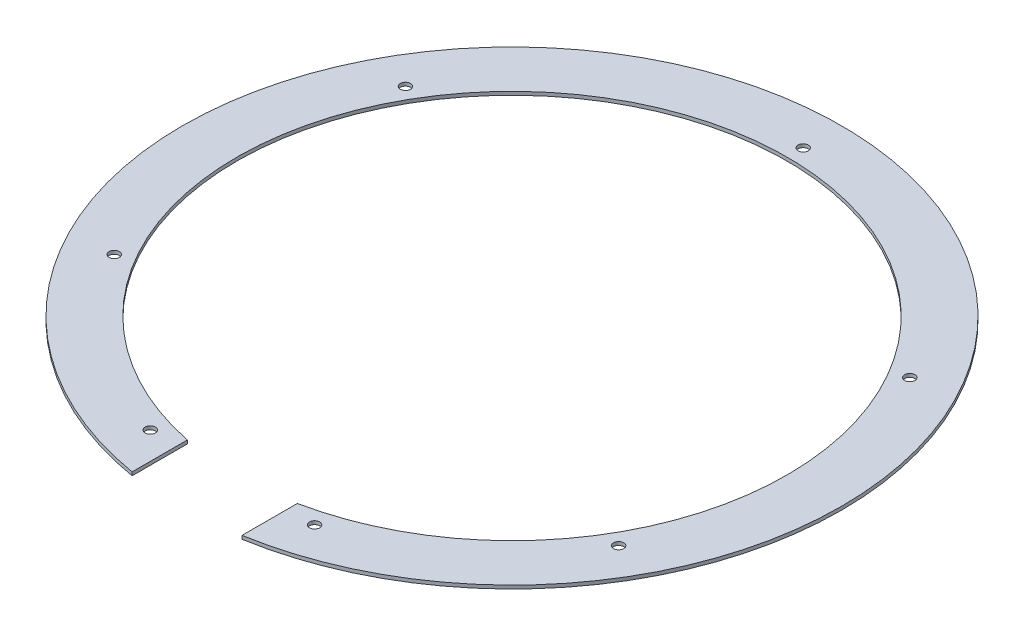
ISO-10303-21;
HEADER;
FILE_DESCRIPTION(('STEP AP214'),'2;1');
FILE_NAME('part.step','',(''),(''),'','','');
FILE_SCHEMA(('AUTOMOTIVE_DESIGN { 1 0 10303 214 1 1 1 1 }'));
ENDSEC;
DATA;
#1=APPLICATION_CONTEXT('core data for automotive mechanical design processes');
#2=APPLICATION_PROTOCOL_DEFINITION('international standard','automotive_design',2000,#1);
#3=PRODUCT_CONTEXT('',#1,'mechanical');
#4=PRODUCT('Part','Part','',(#3));
#5=PRODUCT_RELATED_PRODUCT_CATEGORY('part','',(#4));
#6=PRODUCT_DEFINITION_FORMATION('','',#4);
#7=PRODUCT_DEFINITION_CONTEXT('part definition',#1,'design');
#8=PRODUCT_DEFINITION('design','',#6,#7);
#9=PRODUCT_DEFINITION_SHAPE('','',#8);
#10=(LENGTH_UNIT() NAMED_UNIT(*) SI_UNIT(.MILLI.,.METRE.));
#11=(NAMED_UNIT(*) PLANE_ANGLE_UNIT() SI_UNIT($,.RADIAN.));
#12=(NAMED_UNIT(*) SI_UNIT($,.STERADIAN.) SOLID_ANGLE_UNIT());
#13=UNCERTAINTY_MEASURE_WITH_UNIT(LENGTH_MEASURE(1.E-05),#10,'distance_accuracy_value','');
#14=(GEOMETRIC_REPRESENTATION_CONTEXT(3) GLOBAL_UNCERTAINTY_ASSIGNED_CONTEXT((#13)) GLOBAL_UNIT_ASSIGNED_CONTEXT((#10,
#11,#12)) REPRESENTATION_CONTEXT('',''));
#15=CARTESIAN_POINT('',(0.,0.,0.));
#16=DIRECTION('',(0.,0.,1.));
#17=DIRECTION('',(1.,0.,0.));
#18=AXIS2_PLACEMENT_3D('',#15,#16,#17);
#19=CARTESIAN_POINT('',(0.,1.6002,0.));
#20=DIRECTION('',(0.,1.,0.));
#21=DIRECTION('',(0.,0.,1.));
#22=AXIS2_PLACEMENT_3D('',#19,#20,#21);
#23=PLANE('',#22);
#24=CARTESIAN_POINT('',(38.3911112459704,1.6002,130.632935820093));
#25=DIRECTION('',(0.,1.,0.));
#26=DIRECTION('',(0.,0.,1.));
#27=AXIS2_PLACEMENT_3D('',#24,#25,#26);
#28=CIRCLE('',#27,2.3876);
#29=CARTESIAN_POINT('',(38.3911112459704,1.6002,133.020535820093));
#30=VERTEX_POINT('',#29);
#31=EDGE_CURVE('E101',#30,#30,#28,.F.);
#32=ORIENTED_EDGE('',*,*,#31,.T.);
#33=EDGE_LOOP('',(#32));
#34=FACE_BOUND('',#33,.T.);
#35=CARTESIAN_POINT('',(-38.3911112459704,1.6002,130.632935820093));
#36=DIRECTION('',(0.,1.,0.));
#37=DIRECTION('',(0.,0.,1.));
#38=AXIS2_PLACEMENT_3D('',#35,#36,#37);
#39=CIRCLE('',#38,2.3876);
#40=CARTESIAN_POINT('',(-38.3911112459704,1.6002,133.020535820093));
#41=VERTEX_POINT('',#40);
#42=EDGE_CURVE('E104',#41,#41,#39,.F.);
#43=ORIENTED_EDGE('',*,*,#42,.T.);
#44=EDGE_LOOP('',(#43));
#45=FACE_BOUND('',#44,.T.);
#46=CARTESIAN_POINT('',(-117.833956347034,1.6002,-68.0314664166274));
#47=DIRECTION('',(0.,1.,0.));
#48=DIRECTION('',(0.,0.,1.));
#49=AXIS2_PLACEMENT_3D('',#46,#47,#48);
#50=CIRCLE('',#49,2.38125);
#51=CARTESIAN_POINT('',(-117.833956347034,1.6002,-65.6502164166274));
#52=VERTEX_POINT('',#51);
#53=EDGE_CURVE('E107',#52,#52,#50,.F.);
#54=ORIENTED_EDGE('',*,*,#53,.T.);
#55=EDGE_LOOP('',(#54));
#56=FACE_BOUND('',#55,.T.);
#57=CARTESIAN_POINT('',(-117.833956347034,1.6002,68.0314664166274));
#58=DIRECTION('',(0.,1.,0.));
#59=DIRECTION('',(0.,0.,1.));
#60=AXIS2_PLACEMENT_3D('',#57,#58,#59);
#61=CIRCLE('',#60,2.38125);
#62=CARTESIAN_POINT('',(-117.833956347034,1.6002,70.4127164166274));
#63=VERTEX_POINT('',#62);
#64=EDGE_CURVE('E110',#63,#63,#61,.F.);
#65=ORIENTED_EDGE('',*,*,#64,.T.);
#66=EDGE_LOOP('',(#65));
#67=FACE_BOUND('',#66,.T.);
#68=CARTESIAN_POINT('',(117.833956347034,1.6002,68.0314664166274));
#69=DIRECTION('',(0.,1.,0.));
#70=DIRECTION('',(0.,0.,1.));
#71=AXIS2_PLACEMENT_3D('',#68,#69,#70);
#72=CIRCLE('',#71,2.38125);
#73=CARTESIAN_POINT('',(117.833956347034,1.6002,70.4127164166274));
#74=VERTEX_POINT('',#73);
#75=EDGE_CURVE('E113',#74,#74,#72,.F.);
#76=ORIENTED_EDGE('',*,*,#75,.T.);
#77=EDGE_LOOP('',(#76));
#78=FACE_BOUND('',#77,.T.);
#79=CARTESIAN_POINT('',(117.833956347034,1.6002,-68.0314664166274));
#80=DIRECTION('',(0.,1.,0.));
#81=DIRECTION('',(0.,0.,1.));
#82=AXIS2_PLACEMENT_3D('',#79,#80,#81);
#83=CIRCLE('',#82,2.38125);
#84=CARTESIAN_POINT('',(117.833956347034,1.6002,-65.6502164166274));
#85=VERTEX_POINT('',#84);
#86=EDGE_CURVE('E116',#85,#85,#83,.F.);
#87=ORIENTED_EDGE('',*,*,#86,.T.);
#88=EDGE_LOOP('',(#87));
#89=FACE_BOUND('',#88,.T.);
#90=CARTESIAN_POINT('',(0.,1.6002,-136.06293283328));
#91=DIRECTION('',(0.,1.,0.));
#92=DIRECTION('',(0.,0.,1.));
#93=AXIS2_PLACEMENT_3D('',#90,#91,#92);
#94=CIRCLE('',#93,2.38125);
#95=CARTESIAN_POINT('',(0.,1.6002,-133.68168283328));
#96=VERTEX_POINT('',#95);
#97=EDGE_CURVE('E119',#96,#96,#94,.F.);
#98=ORIENTED_EDGE('',*,*,#97,.T.);
#99=EDGE_LOOP('',(#98));
#100=FACE_BOUND('',#99,.T.);
#101=CARTESIAN_POINT('',(0.,1.6002,0.));
#102=DIRECTION('',(0.,1.,0.));
#103=DIRECTION('',(0.,0.,1.));
#104=AXIS2_PLACEMENT_3D('',#101,#102,#103);
#105=CIRCLE('',#104,128.5875);
#106=CARTESIAN_POINT('',(-25.6911112459694,1.6002,125.994888623298));
#107=VERTEX_POINT('',#106);
#108=CARTESIAN_POINT('',(25.6911112459694,1.6002,125.994888623298));
#109=VERTEX_POINT('',#108);
#110=EDGE_CURVE('E73',#107,#109,#105,.F.);
#111=ORIENTED_EDGE('',*,*,#110,.T.);
#112=DIRECTION('',(0.,0.,1.));
#113=VECTOR('',#112,1.);
#114=CARTESIAN_POINT('',(25.6911112459704,1.6002,125.994888623308));
#115=LINE('',#114,#113);
#116=CARTESIAN_POINT('',(25.6911112459701,1.6002,151.829236180642));
#117=VERTEX_POINT('',#116);
#118=EDGE_CURVE('E59',#117,#109,#115,.F.);
#119=ORIENTED_EDGE('',*,*,#118,.F.);
#120=CARTESIAN_POINT('',(0.,1.6002,0.));
#121=DIRECTION('',(0.,1.,0.));
#122=DIRECTION('',(0.,0.,1.));
#123=AXIS2_PLACEMENT_3D('',#120,#121,#122);
#124=CIRCLE('',#123,153.9875);
#125=CARTESIAN_POINT('',(-25.6911112459704,1.6002,151.829236180644));
#126=VERTEX_POINT('',#125);
#127=EDGE_CURVE('E19',#126,#117,#124,.F.);
#128=ORIENTED_EDGE('',*,*,#127,.F.);
#129=DIRECTION('',(0.,0.,-1.));
#130=VECTOR('',#129,1.);
#131=CARTESIAN_POINT('',(-25.6911112459704,1.6002,151.829236180646));
#132=LINE('',#131,#130);
#133=EDGE_CURVE('E58',#107,#126,#132,.F.);
#134=ORIENTED_EDGE('',*,*,#133,.F.);
#135=EDGE_LOOP('',(#111,#119,#128,#134));
#136=FACE_BOUND('',#135,.T.);
#137=ADVANCED_FACE('F16',(#34,#45,#56,#67,#78,#89,#100,#136),#23,.T.);
#138=CARTESIAN_POINT('',(25.6911112459704,0.,125.994888623308));
#139=DIRECTION('',(-1.,0.,0.));
#140=DIRECTION('',(0.,0.,1.));
#141=AXIS2_PLACEMENT_3D('',#138,#139,#140);
#142=PLANE('',#141);
#143=DIRECTION('',(0.,1.,0.));
#144=VECTOR('',#143,1.);
#145=CARTESIAN_POINT('',(25.6911112459684,0.,125.994888623298));
#146=LINE('',#145,#144);
#147=CARTESIAN_POINT('',(25.6911112459694,0.,125.994888623298));
#148=VERTEX_POINT('',#147);
#149=EDGE_CURVE('E121',#109,#148,#146,.F.);
#150=ORIENTED_EDGE('',*,*,#149,.T.);
#151=DIRECTION('',(0.,0.,1.));
#152=VECTOR('',#151,1.);
#153=CARTESIAN_POINT('',(25.6911112459704,0.,0.));
#154=LINE('',#153,#152);
#155=CARTESIAN_POINT('',(25.6911112459701,0.,151.829236180642));
#156=VERTEX_POINT('',#155);
#157=EDGE_CURVE('E100',#148,#156,#154,.T.);
#158=ORIENTED_EDGE('',*,*,#157,.T.);
#159=DIRECTION('',(0.,1.,0.));
#160=VECTOR('',#159,1.);
#161=CARTESIAN_POINT('',(25.6911112459697,0.,151.829236180642));
#162=LINE('',#161,#160);
#163=EDGE_CURVE('E61',#117,#156,#162,.F.);
#164=ORIENTED_EDGE('',*,*,#163,.F.);
#165=ORIENTED_EDGE('',*,*,#118,.T.);
#166=EDGE_LOOP('',(#150,#158,#164,#165));
#167=FACE_BOUND('',#166,.T.);
#168=ADVANCED_FACE('F186',(#167),#142,.T.);
#169=CARTESIAN_POINT('',(0.,0.,0.));
#170=DIRECTION('',(0.,1.,0.));
#171=DIRECTION('',(0.,0.,1.));
#172=AXIS2_PLACEMENT_3D('',#169,#170,#171);
#173=CYLINDRICAL_SURFACE('',#172,153.9875);
#174=CARTESIAN_POINT('',(0.,0.,0.));
#175=DIRECTION('',(0.,1.,0.));
#176=DIRECTION('',(0.,0.,1.));
#177=AXIS2_PLACEMENT_3D('',#174,#175,#176);
#178=CIRCLE('',#177,153.9875);
#179=CARTESIAN_POINT('',(-25.6911112459704,0.,151.829236180644));
#180=VERTEX_POINT('',#179);
#181=EDGE_CURVE('E71',#156,#180,#178,.T.);
#182=ORIENTED_EDGE('',*,*,#181,.T.);
#183=DIRECTION('',(0.,1.,0.));
#184=VECTOR('',#183,1.);
#185=CARTESIAN_POINT('',(-25.6911112459704,0.,151.829236180646));
#186=LINE('',#185,#184);
#187=EDGE_CURVE('E66',#126,#180,#186,.F.);
#188=ORIENTED_EDGE('',*,*,#187,.F.);
#189=ORIENTED_EDGE('',*,*,#127,.T.);
#190=ORIENTED_EDGE('',*,*,#163,.T.);
#191=EDGE_LOOP('',(#182,#188,#189,#190));
#192=FACE_BOUND('',#191,.T.);
#193=ADVANCED_FACE('F69',(#192),#173,.T.);
#194=CARTESIAN_POINT('',(-25.6911112459704,0.,151.829236180646));
#195=DIRECTION('',(1.,0.,0.));
#196=DIRECTION('',(0.,0.,-1.));
#197=AXIS2_PLACEMENT_3D('',#194,#195,#196);
#198=PLANE('',#197);
#199=ORIENTED_EDGE('',*,*,#187,.T.);
#200=DIRECTION('',(0.,0.,1.));
#201=VECTOR('',#200,1.);
#202=CARTESIAN_POINT('',(-25.6911112459704,0.,0.));
#203=LINE('',#202,#201);
#204=CARTESIAN_POINT('',(-25.6911112459694,0.,125.994888623298));
#205=VERTEX_POINT('',#204);
#206=EDGE_CURVE('E98',#180,#205,#203,.F.);
#207=ORIENTED_EDGE('',*,*,#206,.T.);
#208=DIRECTION('',(0.,1.,0.));
#209=VECTOR('',#208,1.);
#210=CARTESIAN_POINT('',(-25.6911112459685,0.,125.994888623298));
#211=LINE('',#210,#209);
#212=EDGE_CURVE('E34',#205,#107,#211,.T.);
#213=ORIENTED_EDGE('',*,*,#212,.T.);
#214=ORIENTED_EDGE('',*,*,#133,.T.);
#215=EDGE_LOOP('',(#199,#207,#213,#214));
#216=FACE_BOUND('',#215,.T.);
#217=ADVANCED_FACE('F64',(#216),#198,.T.);
#218=CARTESIAN_POINT('',(0.,0.,0.));
#219=DIRECTION('',(0.,1.,0.));
#220=DIRECTION('',(0.,0.,1.));
#221=AXIS2_PLACEMENT_3D('',#218,#219,#220);
#222=CYLINDRICAL_SURFACE('',#221,128.5875);
#223=ORIENTED_EDGE('',*,*,#110,.F.);
#224=ORIENTED_EDGE('',*,*,#212,.F.);
#225=CARTESIAN_POINT('',(0.,0.,0.));
#226=DIRECTION('',(0.,1.,0.));
#227=DIRECTION('',(0.,0.,1.));
#228=AXIS2_PLACEMENT_3D('',#225,#226,#227);
#229=CIRCLE('',#228,128.5875);
#230=EDGE_CURVE('E96',#205,#148,#229,.F.);
#231=ORIENTED_EDGE('',*,*,#230,.T.);
#232=ORIENTED_EDGE('',*,*,#149,.F.);
#233=EDGE_LOOP('',(#223,#224,#231,#232));
#234=FACE_BOUND('',#233,.T.);
#235=ADVANCED_FACE('F131',(#234),#222,.F.);
#236=CARTESIAN_POINT('',(0.,1.6002,-136.06293283328));
#237=DIRECTION('',(0.,1.,0.));
#238=DIRECTION('',(0.,0.,1.));
#239=AXIS2_PLACEMENT_3D('',#236,#237,#238);
#240=CYLINDRICAL_SURFACE('',#239,2.38125);
#241=ORIENTED_EDGE('',*,*,#97,.F.);
#242=EDGE_LOOP('',(#241));
#243=FACE_BOUND('',#242,.T.);
#244=CARTESIAN_POINT('',(0.,0.,-136.06293283328));
#245=DIRECTION('',(0.,1.,0.));
#246=DIRECTION('',(0.,0.,1.));
#247=AXIS2_PLACEMENT_3D('',#244,#245,#246);
#248=CIRCLE('',#247,2.38125);
#249=CARTESIAN_POINT('',(0.,0.,-133.68168283328));
#250=VERTEX_POINT('',#249);
#251=EDGE_CURVE('E93',#250,#250,#248,.F.);
#252=ORIENTED_EDGE('',*,*,#251,.T.);
#253=EDGE_LOOP('',(#252));
#254=FACE_BOUND('',#253,.T.);
#255=ADVANCED_FACE('F133',(#243,#254),#240,.F.);
#256=CARTESIAN_POINT('',(117.833956347034,1.6002,-68.0314664166274));
#257=DIRECTION('',(0.,1.,0.));
#258=DIRECTION('',(0.,0.,1.));
#259=AXIS2_PLACEMENT_3D('',#256,#257,#258);
#260=CYLINDRICAL_SURFACE('',#259,2.38125);
#261=ORIENTED_EDGE('',*,*,#86,.F.);
#262=EDGE_LOOP('',(#261));
#263=FACE_BOUND('',#262,.T.);
#264=CARTESIAN_POINT('',(117.833956347034,0.,-68.0314664166274));
#265=DIRECTION('',(0.,1.,0.));
#266=DIRECTION('',(0.,0.,1.));
#267=AXIS2_PLACEMENT_3D('',#264,#265,#266);
#268=CIRCLE('',#267,2.38125);
#269=CARTESIAN_POINT('',(117.833956347034,0.,-65.6502164166274));
#270=VERTEX_POINT('',#269);
#271=EDGE_CURVE('E90',#270,#270,#268,.F.);
#272=ORIENTED_EDGE('',*,*,#271,.T.);
#273=EDGE_LOOP('',(#272));
#274=FACE_BOUND('',#273,.T.);
#275=ADVANCED_FACE('F140',(#263,#274),#260,.F.);
#276=CARTESIAN_POINT('',(117.833956347034,1.6002,68.0314664166274));
#277=DIRECTION('',(0.,1.,0.));
#278=DIRECTION('',(0.,0.,1.));
#279=AXIS2_PLACEMENT_3D('',#276,#277,#278);
#280=CYLINDRICAL_SURFACE('',#279,2.38125);
#281=ORIENTED_EDGE('',*,*,#75,.F.);
#282=EDGE_LOOP('',(#281));
#283=FACE_BOUND('',#282,.T.);
#284=CARTESIAN_POINT('',(117.833956347034,0.,68.0314664166274));
#285=DIRECTION('',(0.,1.,0.));
#286=DIRECTION('',(0.,0.,1.));
#287=AXIS2_PLACEMENT_3D('',#284,#285,#286);
#288=CIRCLE('',#287,2.38125);
#289=CARTESIAN_POINT('',(117.833956347034,0.,70.4127164166274));
#290=VERTEX_POINT('',#289);
#291=EDGE_CURVE('E87',#290,#290,#288,.F.);
#292=ORIENTED_EDGE('',*,*,#291,.T.);
#293=EDGE_LOOP('',(#292));
#294=FACE_BOUND('',#293,.T.);
#295=ADVANCED_FACE('F167',(#283,#294),#280,.F.);
#296=CARTESIAN_POINT('',(-117.833956347034,1.6002,68.0314664166274));
#297=DIRECTION('',(0.,1.,0.));
#298=DIRECTION('',(0.,0.,1.));
#299=AXIS2_PLACEMENT_3D('',#296,#297,#298);
#300=CYLINDRICAL_SURFACE('',#299,2.38125);
#301=ORIENTED_EDGE('',*,*,#64,.F.);
#302=EDGE_LOOP('',(#301));
#303=FACE_BOUND('',#302,.T.);
#304=CARTESIAN_POINT('',(-117.833956347034,0.,68.0314664166274));
#305=DIRECTION('',(0.,1.,0.));
#306=DIRECTION('',(0.,0.,1.));
#307=AXIS2_PLACEMENT_3D('',#304,#305,#306);
#308=CIRCLE('',#307,2.38125);
#309=CARTESIAN_POINT('',(-117.833956347034,0.,70.4127164166274));
#310=VERTEX_POINT('',#309);
#311=EDGE_CURVE('E84',#310,#310,#308,.F.);
#312=ORIENTED_EDGE('',*,*,#311,.T.);
#313=EDGE_LOOP('',(#312));
#314=FACE_BOUND('',#313,.T.);
#315=ADVANCED_FACE('F163',(#303,#314),#300,.F.);
#316=CARTESIAN_POINT('',(-117.833956347034,1.6002,-68.0314664166274));
#317=DIRECTION('',(0.,1.,0.));
#318=DIRECTION('',(0.,0.,1.));
#319=AXIS2_PLACEMENT_3D('',#316,#317,#318);
#320=CYLINDRICAL_SURFACE('',#319,2.38125);
#321=ORIENTED_EDGE('',*,*,#53,.F.);
#322=EDGE_LOOP('',(#321));
#323=FACE_BOUND('',#322,.T.);
#324=CARTESIAN_POINT('',(-117.833956347034,0.,-68.0314664166274));
#325=DIRECTION('',(0.,1.,0.));
#326=DIRECTION('',(0.,0.,1.));
#327=AXIS2_PLACEMENT_3D('',#324,#325,#326);
#328=CIRCLE('',#327,2.38125);
#329=CARTESIAN_POINT('',(-117.833956347034,0.,-65.6502164166274));
#330=VERTEX_POINT('',#329);
#331=EDGE_CURVE('E81',#330,#330,#328,.F.);
#332=ORIENTED_EDGE('',*,*,#331,.T.);
#333=EDGE_LOOP('',(#332));
#334=FACE_BOUND('',#333,.T.);
#335=ADVANCED_FACE('F159',(#323,#334),#320,.F.);
#336=CARTESIAN_POINT('',(-38.3911112459704,1.6002,130.632935820093));
#337=DIRECTION('',(0.,1.,0.));
#338=DIRECTION('',(0.,0.,1.));
#339=AXIS2_PLACEMENT_3D('',#336,#337,#338);
#340=CYLINDRICAL_SURFACE('',#339,2.3876);
#341=ORIENTED_EDGE('',*,*,#42,.F.);
#342=EDGE_LOOP('',(#341));
#343=FACE_BOUND('',#342,.T.);
#344=CARTESIAN_POINT('',(-38.3911112459704,0.,130.632935820093));
#345=DIRECTION('',(0.,1.,0.));
#346=DIRECTION('',(0.,0.,1.));
#347=AXIS2_PLACEMENT_3D('',#344,#345,#346);
#348=CIRCLE('',#347,2.3876);
#349=CARTESIAN_POINT('',(-38.3911112459704,0.,133.020535820093));
#350=VERTEX_POINT('',#349);
#351=EDGE_CURVE('E25',#350,#350,#348,.F.);
#352=ORIENTED_EDGE('',*,*,#351,.T.);
#353=EDGE_LOOP('',(#352));
#354=FACE_BOUND('',#353,.T.);
#355=ADVANCED_FACE('F151',(#343,#354),#340,.F.);
#356=CARTESIAN_POINT('',(38.3911112459704,1.6002,130.632935820093));
#357=DIRECTION('',(0.,1.,0.));
#358=DIRECTION('',(0.,0.,1.));
#359=AXIS2_PLACEMENT_3D('',#356,#357,#358);
#360=CYLINDRICAL_SURFACE('',#359,2.3876);
#361=ORIENTED_EDGE('',*,*,#31,.F.);
#362=EDGE_LOOP('',(#361));
#363=FACE_BOUND('',#362,.T.);
#364=CARTESIAN_POINT('',(38.3911112459704,0.,130.632935820093));
#365=DIRECTION('',(0.,1.,0.));
#366=DIRECTION('',(0.,0.,1.));
#367=AXIS2_PLACEMENT_3D('',#364,#365,#366);
#368=CIRCLE('',#367,2.3876);
#369=CARTESIAN_POINT('',(38.3911112459704,0.,133.020535820093));
#370=VERTEX_POINT('',#369);
#371=EDGE_CURVE('E11',#370,#370,#368,.F.);
#372=ORIENTED_EDGE('',*,*,#371,.T.);
#373=EDGE_LOOP('',(#372));
#374=FACE_BOUND('',#373,.T.);
#375=ADVANCED_FACE('F145',(#363,#374),#360,.F.);
#376=CARTESIAN_POINT('',(0.,0.,0.));
#377=DIRECTION('',(0.,1.,0.));
#378=DIRECTION('',(0.,0.,1.));
#379=AXIS2_PLACEMENT_3D('',#376,#377,#378);
#380=PLANE('',#379);
#381=ORIENTED_EDGE('',*,*,#371,.F.);
#382=EDGE_LOOP('',(#381));
#383=FACE_BOUND('',#382,.T.);
#384=ORIENTED_EDGE('',*,*,#351,.F.);
#385=EDGE_LOOP('',(#384));
#386=FACE_BOUND('',#385,.T.);
#387=ORIENTED_EDGE('',*,*,#331,.F.);
#388=EDGE_LOOP('',(#387));
#389=FACE_BOUND('',#388,.T.);
#390=ORIENTED_EDGE('',*,*,#311,.F.);
#391=EDGE_LOOP('',(#390));
#392=FACE_BOUND('',#391,.T.);
#393=ORIENTED_EDGE('',*,*,#291,.F.);
#394=EDGE_LOOP('',(#393));
#395=FACE_BOUND('',#394,.T.);
#396=ORIENTED_EDGE('',*,*,#271,.F.);
#397=EDGE_LOOP('',(#396));
#398=FACE_BOUND('',#397,.T.);
#399=ORIENTED_EDGE('',*,*,#251,.F.);
#400=EDGE_LOOP('',(#399));
#401=FACE_BOUND('',#400,.T.);
#402=ORIENTED_EDGE('',*,*,#157,.F.);
#403=ORIENTED_EDGE('',*,*,#230,.F.);
#404=ORIENTED_EDGE('',*,*,#206,.F.);
#405=ORIENTED_EDGE('',*,*,#181,.F.);
#406=EDGE_LOOP('',(#402,#403,#404,#405));
#407=FACE_BOUND('',#406,.T.);
#408=ADVANCED_FACE('F130',(#383,#386,#389,#392,#395,#398,#401,#407),#380,.F.);
#409=CLOSED_SHELL('',(#137,#168,#193,#217,#235,#255,#275,#295,#315,#335,#355,#375,#408));
#410=MANIFOLD_SOLID_BREP('B1',#409);
#411=ADVANCED_BREP_SHAPE_REPRESENTATION('',(#18,#410),#14);
#412=SHAPE_DEFINITION_REPRESENTATION(#9,#411);
ENDSEC;
END-ISO-10303-21;
